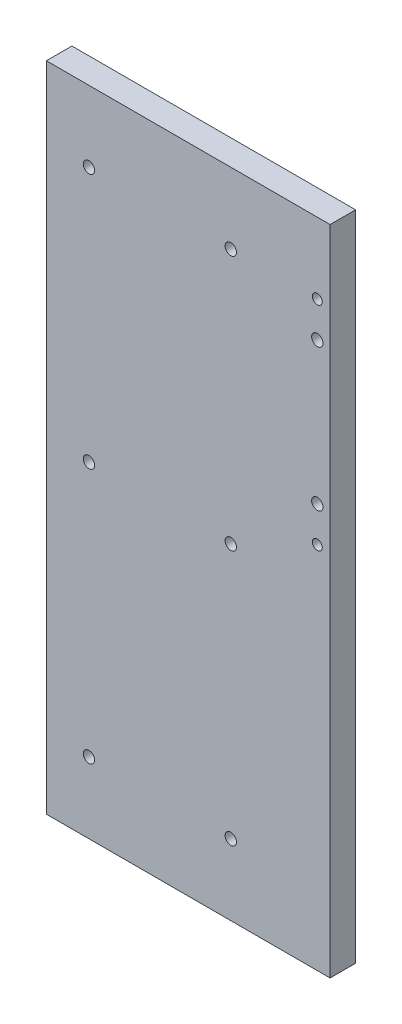
ISO-10303-21;
HEADER;
FILE_DESCRIPTION(('STEP AP214'),'2;1');
FILE_NAME('part.step','',(''),(''),'','','');
FILE_SCHEMA(('AUTOMOTIVE_DESIGN { 1 0 10303 214 1 1 1 1 }'));
ENDSEC;
DATA;
#1=APPLICATION_CONTEXT('core data for automotive mechanical design processes');
#2=APPLICATION_PROTOCOL_DEFINITION('international standard','automotive_design',2000,#1);
#3=PRODUCT_CONTEXT('',#1,'mechanical');
#4=PRODUCT('Part','Part','',(#3));
#5=PRODUCT_RELATED_PRODUCT_CATEGORY('part','',(#4));
#6=PRODUCT_DEFINITION_FORMATION('','',#4);
#7=PRODUCT_DEFINITION_CONTEXT('part definition',#1,'design');
#8=PRODUCT_DEFINITION('design','',#6,#7);
#9=PRODUCT_DEFINITION_SHAPE('','',#8);
#10=(LENGTH_UNIT() NAMED_UNIT(*) SI_UNIT(.MILLI.,.METRE.));
#11=(NAMED_UNIT(*) PLANE_ANGLE_UNIT() SI_UNIT($,.RADIAN.));
#12=(NAMED_UNIT(*) SI_UNIT($,.STERADIAN.) SOLID_ANGLE_UNIT());
#13=UNCERTAINTY_MEASURE_WITH_UNIT(LENGTH_MEASURE(1.E-05),#10,'distance_accuracy_value','');
#14=(GEOMETRIC_REPRESENTATION_CONTEXT(3) GLOBAL_UNCERTAINTY_ASSIGNED_CONTEXT((#13)) GLOBAL_UNIT_ASSIGNED_CONTEXT((#10,
#11,#12)) REPRESENTATION_CONTEXT('',''));
#15=CARTESIAN_POINT('',(0.,0.,0.));
#16=DIRECTION('',(0.,0.,1.));
#17=DIRECTION('',(1.,0.,0.));
#18=AXIS2_PLACEMENT_3D('',#15,#16,#17);
#19=CARTESIAN_POINT('',(100.,230.,18.));
#20=DIRECTION('',(-1.,0.,0.));
#21=DIRECTION('',(0.,-1.,0.));
#22=AXIS2_PLACEMENT_3D('',#19,#20,#21);
#23=PLANE('',#22);
#24=DIRECTION('',(0.,1.,0.));
#25=VECTOR('',#24,1.);
#26=CARTESIAN_POINT('',(100.,230.,0.));
#27=LINE('',#26,#25);
#28=CARTESIAN_POINT('',(100.,-230.,0.));
#29=VERTEX_POINT('',#28);
#30=CARTESIAN_POINT('',(100.,230.,0.));
#31=VERTEX_POINT('',#30);
#32=EDGE_CURVE('E183',#29,#31,#27,.T.);
#33=ORIENTED_EDGE('',*,*,#32,.T.);
#34=DIRECTION('',(0.,0.,-1.));
#35=VECTOR('',#34,1.);
#36=CARTESIAN_POINT('',(100.,230.,18.));
#37=LINE('',#36,#35);
#38=CARTESIAN_POINT('',(100.,230.,18.));
#39=VERTEX_POINT('',#38);
#40=EDGE_CURVE('E11',#39,#31,#37,.T.);
#41=ORIENTED_EDGE('',*,*,#40,.F.);
#42=DIRECTION('',(0.,1.,0.));
#43=VECTOR('',#42,1.);
#44=CARTESIAN_POINT('',(100.,230.,18.));
#45=LINE('',#44,#43);
#46=CARTESIAN_POINT('',(100.,-230.,18.));
#47=VERTEX_POINT('',#46);
#48=EDGE_CURVE('E184',#47,#39,#45,.T.);
#49=ORIENTED_EDGE('',*,*,#48,.F.);
#50=DIRECTION('',(0.,0.,-1.));
#51=VECTOR('',#50,1.);
#52=CARTESIAN_POINT('',(100.,-230.,18.));
#53=LINE('',#52,#51);
#54=EDGE_CURVE('E190',#47,#29,#53,.T.);
#55=ORIENTED_EDGE('',*,*,#54,.T.);
#56=EDGE_LOOP('',(#33,#41,#49,#55));
#57=FACE_BOUND('',#56,.T.);
#58=ADVANCED_FACE('F33',(#57),#23,.F.);
#59=CARTESIAN_POINT('',(-100.,230.,18.));
#60=DIRECTION('',(0.,-1.,0.));
#61=DIRECTION('',(0.,0.,-1.));
#62=AXIS2_PLACEMENT_3D('',#59,#60,#61);
#63=PLANE('',#62);
#64=DIRECTION('',(-1.,0.,0.));
#65=VECTOR('',#64,1.);
#66=CARTESIAN_POINT('',(-100.,230.,0.));
#67=LINE('',#66,#65);
#68=CARTESIAN_POINT('',(-100.,230.,0.));
#69=VERTEX_POINT('',#68);
#70=EDGE_CURVE('E193',#31,#69,#67,.T.);
#71=ORIENTED_EDGE('',*,*,#70,.T.);
#72=DIRECTION('',(0.,0.,-1.));
#73=VECTOR('',#72,1.);
#74=CARTESIAN_POINT('',(-100.,230.,18.));
#75=LINE('',#74,#73);
#76=CARTESIAN_POINT('',(-100.,230.,18.));
#77=VERTEX_POINT('',#76);
#78=EDGE_CURVE('E41',#77,#69,#75,.T.);
#79=ORIENTED_EDGE('',*,*,#78,.F.);
#80=DIRECTION('',(-1.,0.,0.));
#81=VECTOR('',#80,1.);
#82=CARTESIAN_POINT('',(-100.,230.,18.));
#83=LINE('',#82,#81);
#84=EDGE_CURVE('E80',#39,#77,#83,.T.);
#85=ORIENTED_EDGE('',*,*,#84,.F.);
#86=ORIENTED_EDGE('',*,*,#40,.T.);
#87=EDGE_LOOP('',(#71,#79,#85,#86));
#88=FACE_BOUND('',#87,.T.);
#89=ADVANCED_FACE('F220',(#88),#63,.F.);
#90=CARTESIAN_POINT('',(-100.,230.,18.));
#91=DIRECTION('',(1.,0.,0.));
#92=DIRECTION('',(0.,1.,0.));
#93=AXIS2_PLACEMENT_3D('',#90,#91,#92);
#94=PLANE('',#93);
#95=DIRECTION('',(0.,-1.,0.));
#96=VECTOR('',#95,1.);
#97=CARTESIAN_POINT('',(-100.,230.,0.));
#98=LINE('',#97,#96);
#99=CARTESIAN_POINT('',(-100.,-230.,0.));
#100=VERTEX_POINT('',#99);
#101=EDGE_CURVE('E67',#69,#100,#98,.T.);
#102=ORIENTED_EDGE('',*,*,#101,.T.);
#103=DIRECTION('',(0.,0.,-1.));
#104=VECTOR('',#103,1.);
#105=CARTESIAN_POINT('',(-100.,-230.,18.));
#106=LINE('',#105,#104);
#107=CARTESIAN_POINT('',(-100.,-230.,18.));
#108=VERTEX_POINT('',#107);
#109=EDGE_CURVE('E198',#108,#100,#106,.T.);
#110=ORIENTED_EDGE('',*,*,#109,.F.);
#111=DIRECTION('',(0.,-1.,0.));
#112=VECTOR('',#111,1.);
#113=CARTESIAN_POINT('',(-100.,230.,18.));
#114=LINE('',#113,#112);
#115=EDGE_CURVE('E187',#77,#108,#114,.T.);
#116=ORIENTED_EDGE('',*,*,#115,.F.);
#117=ORIENTED_EDGE('',*,*,#78,.T.);
#118=EDGE_LOOP('',(#102,#110,#116,#117));
#119=FACE_BOUND('',#118,.T.);
#120=ADVANCED_FACE('F200',(#119),#94,.F.);
#121=CARTESIAN_POINT('',(-100.,-230.,18.));
#122=DIRECTION('',(0.,1.,0.));
#123=DIRECTION('',(0.,0.,1.));
#124=AXIS2_PLACEMENT_3D('',#121,#122,#123);
#125=PLANE('',#124);
#126=CARTESIAN_POINT('',(0.,-230.,9.));
#127=DIRECTION('',(0.,-1.,0.));
#128=DIRECTION('',(0.,0.,-1.));
#129=AXIS2_PLACEMENT_3D('',#126,#127,#128);
#130=CIRCLE('',#129,3.99999999999999);
#131=CARTESIAN_POINT('',(0.,-230.,5.00000000000001));
#132=VERTEX_POINT('',#131);
#133=EDGE_CURVE('E107',#132,#132,#130,.T.);
#134=ORIENTED_EDGE('',*,*,#133,.F.);
#135=EDGE_LOOP('',(#134));
#136=FACE_BOUND('',#135,.T.);
#137=CARTESIAN_POINT('',(50.0000000000001,-230.,9.));
#138=DIRECTION('',(0.,-1.,0.));
#139=DIRECTION('',(0.,0.,-1.));
#140=AXIS2_PLACEMENT_3D('',#137,#138,#139);
#141=CIRCLE('',#140,2.49999999999999);
#142=CARTESIAN_POINT('',(50.0000000000001,-230.,6.50000000000001));
#143=VERTEX_POINT('',#142);
#144=EDGE_CURVE('E123',#143,#143,#141,.T.);
#145=ORIENTED_EDGE('',*,*,#144,.F.);
#146=EDGE_LOOP('',(#145));
#147=FACE_BOUND('',#146,.T.);
#148=CARTESIAN_POINT('',(-50.,-230.,9.));
#149=DIRECTION('',(0.,-1.,0.));
#150=DIRECTION('',(0.,0.,-1.));
#151=AXIS2_PLACEMENT_3D('',#148,#149,#150);
#152=CIRCLE('',#151,2.49999999999999);
#153=CARTESIAN_POINT('',(-50.,-230.,6.50000000000001));
#154=VERTEX_POINT('',#153);
#155=EDGE_CURVE('E129',#154,#154,#152,.T.);
#156=ORIENTED_EDGE('',*,*,#155,.F.);
#157=EDGE_LOOP('',(#156));
#158=FACE_BOUND('',#157,.T.);
#159=DIRECTION('',(1.,0.,0.));
#160=VECTOR('',#159,1.);
#161=CARTESIAN_POINT('',(-100.,-230.,0.));
#162=LINE('',#161,#160);
#163=EDGE_CURVE('E73',#100,#29,#162,.T.);
#164=ORIENTED_EDGE('',*,*,#163,.T.);
#165=ORIENTED_EDGE('',*,*,#54,.F.);
#166=DIRECTION('',(1.,0.,0.));
#167=VECTOR('',#166,1.);
#168=CARTESIAN_POINT('',(-100.,-230.,18.));
#169=LINE('',#168,#167);
#170=EDGE_CURVE('E49',#108,#47,#169,.T.);
#171=ORIENTED_EDGE('',*,*,#170,.F.);
#172=ORIENTED_EDGE('',*,*,#109,.T.);
#173=EDGE_LOOP('',(#164,#165,#171,#172));
#174=FACE_BOUND('',#173,.T.);
#175=ADVANCED_FACE('F207',(#136,#147,#158,#174),#125,.F.);
#176=CARTESIAN_POINT('',(0.,0.,18.));
#177=DIRECTION('',(0.,0.,1.));
#178=DIRECTION('',(1.,0.,0.));
#179=AXIS2_PLACEMENT_3D('',#176,#177,#178);
#180=PLANE('',#179);
#181=CARTESIAN_POINT('',(91.0000000000001,54.9999999999998,18.));
#182=DIRECTION('',(0.,0.,1.));
#183=DIRECTION('',(1.,0.,0.));
#184=AXIS2_PLACEMENT_3D('',#181,#182,#183);
#185=CIRCLE('',#184,3.99999999999999);
#186=CARTESIAN_POINT('',(95.0000000000001,54.9999999999998,18.));
#187=VERTEX_POINT('',#186);
#188=EDGE_CURVE('E106',#187,#187,#185,.T.);
#189=ORIENTED_EDGE('',*,*,#188,.F.);
#190=EDGE_LOOP('',(#189));
#191=FACE_BOUND('',#190,.T.);
#192=CARTESIAN_POINT('',(91.0000000000001,155.,18.));
#193=DIRECTION('',(0.,0.,1.));
#194=DIRECTION('',(1.,0.,0.));
#195=AXIS2_PLACEMENT_3D('',#192,#193,#194);
#196=CIRCLE('',#195,3.99999999999999);
#197=CARTESIAN_POINT('',(95.0000000000001,155.,18.));
#198=VERTEX_POINT('',#197);
#199=EDGE_CURVE('E117',#198,#198,#196,.T.);
#200=ORIENTED_EDGE('',*,*,#199,.F.);
#201=EDGE_LOOP('',(#200));
#202=FACE_BOUND('',#201,.T.);
#203=CARTESIAN_POINT('',(91.,29.9999999999998,18.));
#204=DIRECTION('',(0.,0.,1.));
#205=DIRECTION('',(1.,0.,0.));
#206=AXIS2_PLACEMENT_3D('',#203,#204,#205);
#207=CIRCLE('',#206,3.49999999999999);
#208=CARTESIAN_POINT('',(94.5,29.9999999999998,18.));
#209=VERTEX_POINT('',#208);
#210=EDGE_CURVE('E135',#209,#209,#207,.T.);
#211=ORIENTED_EDGE('',*,*,#210,.F.);
#212=EDGE_LOOP('',(#211));
#213=FACE_BOUND('',#212,.T.);
#214=CARTESIAN_POINT('',(91.0000000000001,180.,18.));
#215=DIRECTION('',(0.,0.,1.));
#216=DIRECTION('',(1.,0.,0.));
#217=AXIS2_PLACEMENT_3D('',#214,#215,#216);
#218=CIRCLE('',#217,3.49999999999999);
#219=CARTESIAN_POINT('',(94.5000000000001,180.,18.));
#220=VERTEX_POINT('',#219);
#221=EDGE_CURVE('E141',#220,#220,#218,.T.);
#222=ORIENTED_EDGE('',*,*,#221,.F.);
#223=EDGE_LOOP('',(#222));
#224=FACE_BOUND('',#223,.T.);
#225=CARTESIAN_POINT('',(30.,-180.,18.));
#226=DIRECTION('',(0.,0.,1.));
#227=DIRECTION('',(1.,0.,0.));
#228=AXIS2_PLACEMENT_3D('',#225,#226,#227);
#229=CIRCLE('',#228,3.99999999999999);
#230=CARTESIAN_POINT('',(34.,-180.,18.));
#231=VERTEX_POINT('',#230);
#232=EDGE_CURVE('E147',#231,#231,#229,.T.);
#233=ORIENTED_EDGE('',*,*,#232,.F.);
#234=EDGE_LOOP('',(#233));
#235=FACE_BOUND('',#234,.T.);
#236=CARTESIAN_POINT('',(-70.0000000000002,-180.,18.));
#237=DIRECTION('',(0.,0.,1.));
#238=DIRECTION('',(1.,0.,0.));
#239=AXIS2_PLACEMENT_3D('',#236,#237,#238);
#240=CIRCLE('',#239,3.99999999999999);
#241=CARTESIAN_POINT('',(-66.0000000000002,-180.,18.));
#242=VERTEX_POINT('',#241);
#243=EDGE_CURVE('E153',#242,#242,#240,.T.);
#244=ORIENTED_EDGE('',*,*,#243,.F.);
#245=EDGE_LOOP('',(#244));
#246=FACE_BOUND('',#245,.T.);
#247=CARTESIAN_POINT('',(-70.0000000000001,0.,18.));
#248=DIRECTION('',(0.,0.,1.));
#249=DIRECTION('',(1.,0.,0.));
#250=AXIS2_PLACEMENT_3D('',#247,#248,#249);
#251=CIRCLE('',#250,3.99999999999999);
#252=CARTESIAN_POINT('',(-66.0000000000001,0.,18.));
#253=VERTEX_POINT('',#252);
#254=EDGE_CURVE('E159',#253,#253,#251,.T.);
#255=ORIENTED_EDGE('',*,*,#254,.F.);
#256=EDGE_LOOP('',(#255));
#257=FACE_BOUND('',#256,.T.);
#258=CARTESIAN_POINT('',(30.,0.,18.));
#259=DIRECTION('',(0.,0.,1.));
#260=DIRECTION('',(1.,0.,0.));
#261=AXIS2_PLACEMENT_3D('',#258,#259,#260);
#262=CIRCLE('',#261,3.99999999999999);
#263=CARTESIAN_POINT('',(33.9999999999999,0.,18.));
#264=VERTEX_POINT('',#263);
#265=EDGE_CURVE('E165',#264,#264,#262,.T.);
#266=ORIENTED_EDGE('',*,*,#265,.F.);
#267=EDGE_LOOP('',(#266));
#268=FACE_BOUND('',#267,.T.);
#269=CARTESIAN_POINT('',(29.9999999999999,180.,18.));
#270=DIRECTION('',(0.,0.,1.));
#271=DIRECTION('',(1.,0.,0.));
#272=AXIS2_PLACEMENT_3D('',#269,#270,#271);
#273=CIRCLE('',#272,3.99999999999999);
#274=CARTESIAN_POINT('',(33.9999999999999,180.,18.));
#275=VERTEX_POINT('',#274);
#276=EDGE_CURVE('E171',#275,#275,#273,.T.);
#277=ORIENTED_EDGE('',*,*,#276,.F.);
#278=EDGE_LOOP('',(#277));
#279=FACE_BOUND('',#278,.T.);
#280=CARTESIAN_POINT('',(-70.0000000000001,180.,18.));
#281=DIRECTION('',(0.,0.,1.));
#282=DIRECTION('',(1.,0.,0.));
#283=AXIS2_PLACEMENT_3D('',#280,#281,#282);
#284=CIRCLE('',#283,3.99999999999999);
#285=CARTESIAN_POINT('',(-66.0000000000002,180.,18.));
#286=VERTEX_POINT('',#285);
#287=EDGE_CURVE('E177',#286,#286,#284,.T.);
#288=ORIENTED_EDGE('',*,*,#287,.F.);
#289=EDGE_LOOP('',(#288));
#290=FACE_BOUND('',#289,.T.);
#291=ORIENTED_EDGE('',*,*,#48,.T.);
#292=ORIENTED_EDGE('',*,*,#84,.T.);
#293=ORIENTED_EDGE('',*,*,#115,.T.);
#294=ORIENTED_EDGE('',*,*,#170,.T.);
#295=EDGE_LOOP('',(#291,#292,#293,#294));
#296=FACE_BOUND('',#295,.T.);
#297=ADVANCED_FACE('F209',(#191,#202,#213,#224,#235,#246,#257,#268,#279,#290,#296),#180,.T.);
#298=CARTESIAN_POINT('',(0.,0.,0.));
#299=DIRECTION('',(0.,0.,1.));
#300=DIRECTION('',(1.,0.,0.));
#301=AXIS2_PLACEMENT_3D('',#298,#299,#300);
#302=PLANE('',#301);
#303=CARTESIAN_POINT('',(91.,29.9999999999998,0.));
#304=DIRECTION('',(0.,0.,1.));
#305=DIRECTION('',(1.,0.,0.));
#306=AXIS2_PLACEMENT_3D('',#303,#304,#305);
#307=CIRCLE('',#306,3.49999999999999);
#308=CARTESIAN_POINT('',(94.5,29.9999999999998,0.));
#309=VERTEX_POINT('',#308);
#310=EDGE_CURVE('E138',#309,#309,#307,.T.);
#311=ORIENTED_EDGE('',*,*,#310,.T.);
#312=EDGE_LOOP('',(#311));
#313=FACE_BOUND('',#312,.T.);
#314=CARTESIAN_POINT('',(91.0000000000001,180.,0.));
#315=DIRECTION('',(0.,0.,1.));
#316=DIRECTION('',(1.,0.,0.));
#317=AXIS2_PLACEMENT_3D('',#314,#315,#316);
#318=CIRCLE('',#317,3.49999999999999);
#319=CARTESIAN_POINT('',(94.5000000000001,180.,0.));
#320=VERTEX_POINT('',#319);
#321=EDGE_CURVE('E144',#320,#320,#318,.T.);
#322=ORIENTED_EDGE('',*,*,#321,.T.);
#323=EDGE_LOOP('',(#322));
#324=FACE_BOUND('',#323,.T.);
#325=CARTESIAN_POINT('',(30.,-180.,0.));
#326=DIRECTION('',(0.,0.,1.));
#327=DIRECTION('',(1.,0.,0.));
#328=AXIS2_PLACEMENT_3D('',#325,#326,#327);
#329=CIRCLE('',#328,4.);
#330=CARTESIAN_POINT('',(34.,-180.,0.));
#331=VERTEX_POINT('',#330);
#332=EDGE_CURVE('E150',#331,#331,#329,.T.);
#333=ORIENTED_EDGE('',*,*,#332,.T.);
#334=EDGE_LOOP('',(#333));
#335=FACE_BOUND('',#334,.T.);
#336=CARTESIAN_POINT('',(-70.0000000000002,-180.,0.));
#337=DIRECTION('',(0.,0.,1.));
#338=DIRECTION('',(1.,0.,0.));
#339=AXIS2_PLACEMENT_3D('',#336,#337,#338);
#340=CIRCLE('',#339,4.);
#341=CARTESIAN_POINT('',(-66.0000000000002,-180.,0.));
#342=VERTEX_POINT('',#341);
#343=EDGE_CURVE('E156',#342,#342,#340,.T.);
#344=ORIENTED_EDGE('',*,*,#343,.T.);
#345=EDGE_LOOP('',(#344));
#346=FACE_BOUND('',#345,.T.);
#347=CARTESIAN_POINT('',(-70.0000000000001,0.,0.));
#348=DIRECTION('',(0.,0.,1.));
#349=DIRECTION('',(1.,0.,0.));
#350=AXIS2_PLACEMENT_3D('',#347,#348,#349);
#351=CIRCLE('',#350,4.);
#352=CARTESIAN_POINT('',(-66.0000000000001,0.,0.));
#353=VERTEX_POINT('',#352);
#354=EDGE_CURVE('E162',#353,#353,#351,.T.);
#355=ORIENTED_EDGE('',*,*,#354,.T.);
#356=EDGE_LOOP('',(#355));
#357=FACE_BOUND('',#356,.T.);
#358=CARTESIAN_POINT('',(30.,0.,0.));
#359=DIRECTION('',(0.,0.,1.));
#360=DIRECTION('',(1.,0.,0.));
#361=AXIS2_PLACEMENT_3D('',#358,#359,#360);
#362=CIRCLE('',#361,4.);
#363=CARTESIAN_POINT('',(34.,0.,0.));
#364=VERTEX_POINT('',#363);
#365=EDGE_CURVE('E168',#364,#364,#362,.T.);
#366=ORIENTED_EDGE('',*,*,#365,.T.);
#367=EDGE_LOOP('',(#366));
#368=FACE_BOUND('',#367,.T.);
#369=CARTESIAN_POINT('',(29.9999999999999,180.,0.));
#370=DIRECTION('',(0.,0.,1.));
#371=DIRECTION('',(1.,0.,0.));
#372=AXIS2_PLACEMENT_3D('',#369,#370,#371);
#373=CIRCLE('',#372,4.);
#374=CARTESIAN_POINT('',(33.9999999999999,180.,0.));
#375=VERTEX_POINT('',#374);
#376=EDGE_CURVE('E174',#375,#375,#373,.T.);
#377=ORIENTED_EDGE('',*,*,#376,.T.);
#378=EDGE_LOOP('',(#377));
#379=FACE_BOUND('',#378,.T.);
#380=CARTESIAN_POINT('',(-70.0000000000001,180.,0.));
#381=DIRECTION('',(0.,0.,1.));
#382=DIRECTION('',(1.,0.,0.));
#383=AXIS2_PLACEMENT_3D('',#380,#381,#382);
#384=CIRCLE('',#383,4.);
#385=CARTESIAN_POINT('',(-66.0000000000001,180.,0.));
#386=VERTEX_POINT('',#385);
#387=EDGE_CURVE('E180',#386,#386,#384,.T.);
#388=ORIENTED_EDGE('',*,*,#387,.T.);
#389=EDGE_LOOP('',(#388));
#390=FACE_BOUND('',#389,.T.);
#391=ORIENTED_EDGE('',*,*,#32,.F.);
#392=ORIENTED_EDGE('',*,*,#163,.F.);
#393=ORIENTED_EDGE('',*,*,#101,.F.);
#394=ORIENTED_EDGE('',*,*,#70,.F.);
#395=EDGE_LOOP('',(#391,#392,#393,#394));
#396=FACE_BOUND('',#395,.T.);
#397=ADVANCED_FACE('F203',(#313,#324,#335,#346,#357,#368,#379,#390,#396),#302,.F.);
#398=CARTESIAN_POINT('',(-70.0000000000001,180.,18.));
#399=DIRECTION('',(0.,0.,1.));
#400=DIRECTION('',(1.,0.,0.));
#401=AXIS2_PLACEMENT_3D('',#398,#399,#400);
#402=CYLINDRICAL_SURFACE('',#401,4.);
#403=ORIENTED_EDGE('',*,*,#387,.F.);
#404=EDGE_LOOP('',(#403));
#405=FACE_BOUND('',#404,.T.);
#406=ORIENTED_EDGE('',*,*,#287,.T.);
#407=EDGE_LOOP('',(#406));
#408=FACE_BOUND('',#407,.T.);
#409=ADVANCED_FACE('F255',(#405,#408),#402,.F.);
#410=CARTESIAN_POINT('',(29.9999999999999,180.,18.));
#411=DIRECTION('',(0.,0.,1.));
#412=DIRECTION('',(1.,0.,0.));
#413=AXIS2_PLACEMENT_3D('',#410,#411,#412);
#414=CYLINDRICAL_SURFACE('',#413,3.99999999999999);
#415=ORIENTED_EDGE('',*,*,#376,.F.);
#416=EDGE_LOOP('',(#415));
#417=FACE_BOUND('',#416,.T.);
#418=ORIENTED_EDGE('',*,*,#276,.T.);
#419=EDGE_LOOP('',(#418));
#420=FACE_BOUND('',#419,.T.);
#421=ADVANCED_FACE('F265',(#417,#420),#414,.F.);
#422=CARTESIAN_POINT('',(30.,0.,18.));
#423=DIRECTION('',(0.,0.,1.));
#424=DIRECTION('',(1.,0.,0.));
#425=AXIS2_PLACEMENT_3D('',#422,#423,#424);
#426=CYLINDRICAL_SURFACE('',#425,3.99999999999999);
#427=ORIENTED_EDGE('',*,*,#365,.F.);
#428=EDGE_LOOP('',(#427));
#429=FACE_BOUND('',#428,.T.);
#430=ORIENTED_EDGE('',*,*,#265,.T.);
#431=EDGE_LOOP('',(#430));
#432=FACE_BOUND('',#431,.T.);
#433=ADVANCED_FACE('F272',(#429,#432),#426,.F.);
#434=CARTESIAN_POINT('',(-70.0000000000001,0.,18.));
#435=DIRECTION('',(0.,0.,1.));
#436=DIRECTION('',(1.,0.,0.));
#437=AXIS2_PLACEMENT_3D('',#434,#435,#436);
#438=CYLINDRICAL_SURFACE('',#437,4.);
#439=ORIENTED_EDGE('',*,*,#354,.F.);
#440=EDGE_LOOP('',(#439));
#441=FACE_BOUND('',#440,.T.);
#442=ORIENTED_EDGE('',*,*,#254,.T.);
#443=EDGE_LOOP('',(#442));
#444=FACE_BOUND('',#443,.T.);
#445=ADVANCED_FACE('F280',(#441,#444),#438,.F.);
#446=CARTESIAN_POINT('',(-70.0000000000002,-180.,18.));
#447=DIRECTION('',(0.,0.,1.));
#448=DIRECTION('',(1.,0.,0.));
#449=AXIS2_PLACEMENT_3D('',#446,#447,#448);
#450=CYLINDRICAL_SURFACE('',#449,4.);
#451=ORIENTED_EDGE('',*,*,#343,.F.);
#452=EDGE_LOOP('',(#451));
#453=FACE_BOUND('',#452,.T.);
#454=ORIENTED_EDGE('',*,*,#243,.T.);
#455=EDGE_LOOP('',(#454));
#456=FACE_BOUND('',#455,.T.);
#457=ADVANCED_FACE('F288',(#453,#456),#450,.F.);
#458=CARTESIAN_POINT('',(30.,-180.,18.));
#459=DIRECTION('',(0.,0.,1.));
#460=DIRECTION('',(1.,0.,0.));
#461=AXIS2_PLACEMENT_3D('',#458,#459,#460);
#462=CYLINDRICAL_SURFACE('',#461,3.99999999999999);
#463=ORIENTED_EDGE('',*,*,#332,.F.);
#464=EDGE_LOOP('',(#463));
#465=FACE_BOUND('',#464,.T.);
#466=ORIENTED_EDGE('',*,*,#232,.T.);
#467=EDGE_LOOP('',(#466));
#468=FACE_BOUND('',#467,.T.);
#469=ADVANCED_FACE('F296',(#465,#468),#462,.F.);
#470=CARTESIAN_POINT('',(91.0000000000001,180.,18.));
#471=DIRECTION('',(0.,0.,1.));
#472=DIRECTION('',(1.,0.,0.));
#473=AXIS2_PLACEMENT_3D('',#470,#471,#472);
#474=CYLINDRICAL_SURFACE('',#473,3.49999999999999);
#475=ORIENTED_EDGE('',*,*,#321,.F.);
#476=EDGE_LOOP('',(#475));
#477=FACE_BOUND('',#476,.T.);
#478=ORIENTED_EDGE('',*,*,#221,.T.);
#479=EDGE_LOOP('',(#478));
#480=FACE_BOUND('',#479,.T.);
#481=ADVANCED_FACE('F303',(#477,#480),#474,.F.);
#482=CARTESIAN_POINT('',(91.,29.9999999999998,18.));
#483=DIRECTION('',(0.,0.,1.));
#484=DIRECTION('',(1.,0.,0.));
#485=AXIS2_PLACEMENT_3D('',#482,#483,#484);
#486=CYLINDRICAL_SURFACE('',#485,3.49999999999999);
#487=ORIENTED_EDGE('',*,*,#310,.F.);
#488=EDGE_LOOP('',(#487));
#489=FACE_BOUND('',#488,.T.);
#490=ORIENTED_EDGE('',*,*,#210,.T.);
#491=EDGE_LOOP('',(#490));
#492=FACE_BOUND('',#491,.T.);
#493=ADVANCED_FACE('F310',(#489,#492),#486,.F.);
#494=CARTESIAN_POINT('',(-50.,-185.,9.));
#495=DIRECTION('',(0.,-1.,0.));
#496=DIRECTION('',(0.,0.,-1.));
#497=AXIS2_PLACEMENT_3D('',#494,#495,#496);
#498=CONICAL_SURFACE('',#497,2.49999999999998,1.02974425867665);
#499=CARTESIAN_POINT('',(-50.,-183.497848452431,9.));
#500=VERTEX_POINT('',#499);
#501=VERTEX_LOOP('',#500);
#502=FACE_BOUND('',#501,.T.);
#503=CARTESIAN_POINT('',(-50.,-185.,9.));
#504=DIRECTION('',(0.,-1.,0.));
#505=DIRECTION('',(0.,0.,-1.));
#506=AXIS2_PLACEMENT_3D('',#503,#504,#505);
#507=CIRCLE('',#506,2.49999999999998);
#508=CARTESIAN_POINT('',(-50.,-185.,6.50000000000002));
#509=VERTEX_POINT('',#508);
#510=EDGE_CURVE('E132',#509,#509,#507,.T.);
#511=ORIENTED_EDGE('',*,*,#510,.T.);
#512=EDGE_LOOP('',(#511));
#513=FACE_BOUND('',#512,.T.);
#514=ADVANCED_FACE('F318',(#502,#513),#498,.F.);
#515=CARTESIAN_POINT('',(-50.,-230.,9.));
#516=DIRECTION('',(0.,-1.,0.));
#517=DIRECTION('',(0.,0.,-1.));
#518=AXIS2_PLACEMENT_3D('',#515,#516,#517);
#519=CYLINDRICAL_SURFACE('',#518,2.49999999999998);
#520=ORIENTED_EDGE('',*,*,#510,.F.);
#521=EDGE_LOOP('',(#520));
#522=FACE_BOUND('',#521,.T.);
#523=ORIENTED_EDGE('',*,*,#155,.T.);
#524=EDGE_LOOP('',(#523));
#525=FACE_BOUND('',#524,.T.);
#526=ADVANCED_FACE('F326',(#522,#525),#519,.F.);
#527=CARTESIAN_POINT('',(50.0000000000001,-185.,9.));
#528=DIRECTION('',(0.,-1.,0.));
#529=DIRECTION('',(0.,0.,-1.));
#530=AXIS2_PLACEMENT_3D('',#527,#528,#529);
#531=CONICAL_SURFACE('',#530,2.49999999999998,1.02974425867665);
#532=CARTESIAN_POINT('',(50.,-183.497848452431,9.));
#533=VERTEX_POINT('',#532);
#534=VERTEX_LOOP('',#533);
#535=FACE_BOUND('',#534,.T.);
#536=CARTESIAN_POINT('',(50.0000000000001,-185.,9.));
#537=DIRECTION('',(0.,-1.,0.));
#538=DIRECTION('',(0.,0.,-1.));
#539=AXIS2_PLACEMENT_3D('',#536,#537,#538);
#540=CIRCLE('',#539,2.49999999999998);
#541=CARTESIAN_POINT('',(50.0000000000001,-185.,6.50000000000002));
#542=VERTEX_POINT('',#541);
#543=EDGE_CURVE('E126',#542,#542,#540,.T.);
#544=ORIENTED_EDGE('',*,*,#543,.T.);
#545=EDGE_LOOP('',(#544));
#546=FACE_BOUND('',#545,.T.);
#547=ADVANCED_FACE('F334',(#535,#546),#531,.F.);
#548=CARTESIAN_POINT('',(50.0000000000001,-230.,9.));
#549=DIRECTION('',(0.,-1.,0.));
#550=DIRECTION('',(0.,0.,-1.));
#551=AXIS2_PLACEMENT_3D('',#548,#549,#550);
#552=CYLINDRICAL_SURFACE('',#551,2.49999999999998);
#553=ORIENTED_EDGE('',*,*,#543,.F.);
#554=EDGE_LOOP('',(#553));
#555=FACE_BOUND('',#554,.T.);
#556=ORIENTED_EDGE('',*,*,#144,.T.);
#557=EDGE_LOOP('',(#556));
#558=FACE_BOUND('',#557,.T.);
#559=ADVANCED_FACE('F342',(#555,#558),#552,.F.);
#560=CARTESIAN_POINT('',(91.0000000000001,155.,3.));
#561=DIRECTION('',(0.,0.,1.));
#562=DIRECTION('',(1.,0.,0.));
#563=AXIS2_PLACEMENT_3D('',#560,#561,#562);
#564=CONICAL_SURFACE('',#563,3.99999999999999,1.02974425867665);
#565=CARTESIAN_POINT('',(91.0000000000001,155.,0.596557523889759));
#566=VERTEX_POINT('',#565);
#567=VERTEX_LOOP('',#566);
#568=FACE_BOUND('',#567,.T.);
#569=CARTESIAN_POINT('',(91.0000000000001,155.,3.));
#570=DIRECTION('',(0.,0.,1.));
#571=DIRECTION('',(1.,0.,0.));
#572=AXIS2_PLACEMENT_3D('',#569,#570,#571);
#573=CIRCLE('',#572,3.99999999999999);
#574=CARTESIAN_POINT('',(95.0000000000001,155.,3.));
#575=VERTEX_POINT('',#574);
#576=EDGE_CURVE('E120',#575,#575,#573,.T.);
#577=ORIENTED_EDGE('',*,*,#576,.T.);
#578=EDGE_LOOP('',(#577));
#579=FACE_BOUND('',#578,.T.);
#580=ADVANCED_FACE('F349',(#568,#579),#564,.F.);
#581=CARTESIAN_POINT('',(91.0000000000001,155.,18.));
#582=DIRECTION('',(0.,0.,1.));
#583=DIRECTION('',(1.,0.,0.));
#584=AXIS2_PLACEMENT_3D('',#581,#582,#583);
#585=CYLINDRICAL_SURFACE('',#584,3.99999999999999);
#586=ORIENTED_EDGE('',*,*,#576,.F.);
#587=EDGE_LOOP('',(#586));
#588=FACE_BOUND('',#587,.T.);
#589=ORIENTED_EDGE('',*,*,#199,.T.);
#590=EDGE_LOOP('',(#589));
#591=FACE_BOUND('',#590,.T.);
#592=ADVANCED_FACE('F356',(#588,#591),#585,.F.);
#593=CARTESIAN_POINT('',(91.0000000000001,54.9999999999998,3.));
#594=DIRECTION('',(0.,0.,1.));
#595=DIRECTION('',(1.,0.,0.));
#596=AXIS2_PLACEMENT_3D('',#593,#594,#595);
#597=CONICAL_SURFACE('',#596,3.99999999999999,1.02974425867665);
#598=CARTESIAN_POINT('',(91.0000000000001,54.9999999999998,0.596557523889759));
#599=VERTEX_POINT('',#598);
#600=VERTEX_LOOP('',#599);
#601=FACE_BOUND('',#600,.T.);
#602=CARTESIAN_POINT('',(91.0000000000001,54.9999999999998,3.));
#603=DIRECTION('',(0.,0.,1.));
#604=DIRECTION('',(1.,0.,0.));
#605=AXIS2_PLACEMENT_3D('',#602,#603,#604);
#606=CIRCLE('',#605,3.99999999999999);
#607=CARTESIAN_POINT('',(95.0000000000001,54.9999999999998,3.));
#608=VERTEX_POINT('',#607);
#609=EDGE_CURVE('E110',#608,#608,#606,.T.);
#610=ORIENTED_EDGE('',*,*,#609,.T.);
#611=EDGE_LOOP('',(#610));
#612=FACE_BOUND('',#611,.T.);
#613=ADVANCED_FACE('F364',(#601,#612),#597,.F.);
#614=CARTESIAN_POINT('',(91.0000000000001,54.9999999999998,18.));
#615=DIRECTION('',(0.,0.,1.));
#616=DIRECTION('',(1.,0.,0.));
#617=AXIS2_PLACEMENT_3D('',#614,#615,#616);
#618=CYLINDRICAL_SURFACE('',#617,3.99999999999999);
#619=ORIENTED_EDGE('',*,*,#609,.F.);
#620=EDGE_LOOP('',(#619));
#621=FACE_BOUND('',#620,.T.);
#622=ORIENTED_EDGE('',*,*,#188,.T.);
#623=EDGE_LOOP('',(#622));
#624=FACE_BOUND('',#623,.T.);
#625=ADVANCED_FACE('F100',(#621,#624),#618,.F.);
#626=CARTESIAN_POINT('',(0.,-208.,9.));
#627=DIRECTION('',(0.,-1.,0.));
#628=DIRECTION('',(0.,0.,-1.));
#629=AXIS2_PLACEMENT_3D('',#626,#627,#628);
#630=CONICAL_SURFACE('',#629,4.,1.02974425867665);
#631=CARTESIAN_POINT('',(0.,-205.59655752389,9.));
#632=VERTEX_POINT('',#631);
#633=VERTEX_LOOP('',#632);
#634=FACE_BOUND('',#633,.T.);
#635=CARTESIAN_POINT('',(0.,-208.,9.));
#636=DIRECTION('',(0.,-1.,0.));
#637=DIRECTION('',(0.,0.,-1.));
#638=AXIS2_PLACEMENT_3D('',#635,#636,#637);
#639=CIRCLE('',#638,4.);
#640=CARTESIAN_POINT('',(0.,-208.,5.));
#641=VERTEX_POINT('',#640);
#642=EDGE_CURVE('E104',#641,#641,#639,.T.);
#643=ORIENTED_EDGE('',*,*,#642,.T.);
#644=EDGE_LOOP('',(#643));
#645=FACE_BOUND('',#644,.T.);
#646=ADVANCED_FACE('F96',(#634,#645),#630,.F.);
#647=CARTESIAN_POINT('',(0.,-230.,9.));
#648=DIRECTION('',(0.,-1.,0.));
#649=DIRECTION('',(0.,0.,-1.));
#650=AXIS2_PLACEMENT_3D('',#647,#648,#649);
#651=CYLINDRICAL_SURFACE('',#650,3.99999999999999);
#652=ORIENTED_EDGE('',*,*,#642,.F.);
#653=EDGE_LOOP('',(#652));
#654=FACE_BOUND('',#653,.T.);
#655=ORIENTED_EDGE('',*,*,#133,.T.);
#656=EDGE_LOOP('',(#655));
#657=FACE_BOUND('',#656,.T.);
#658=ADVANCED_FACE('F99',(#654,#657),#651,.F.);
#659=CLOSED_SHELL('',(#58,#89,#120,#175,#297,#397,#409,#421,#433,#445,#457,#469,#481,#493,#514,
#526,#547,#559,#580,#592,#613,#625,#646,#658));
#660=MANIFOLD_SOLID_BREP('B2',#659);
#661=ADVANCED_BREP_SHAPE_REPRESENTATION('',(#18,#660),#14);
#662=SHAPE_DEFINITION_REPRESENTATION(#9,#661);
ENDSEC;
END-ISO-10303-21;
